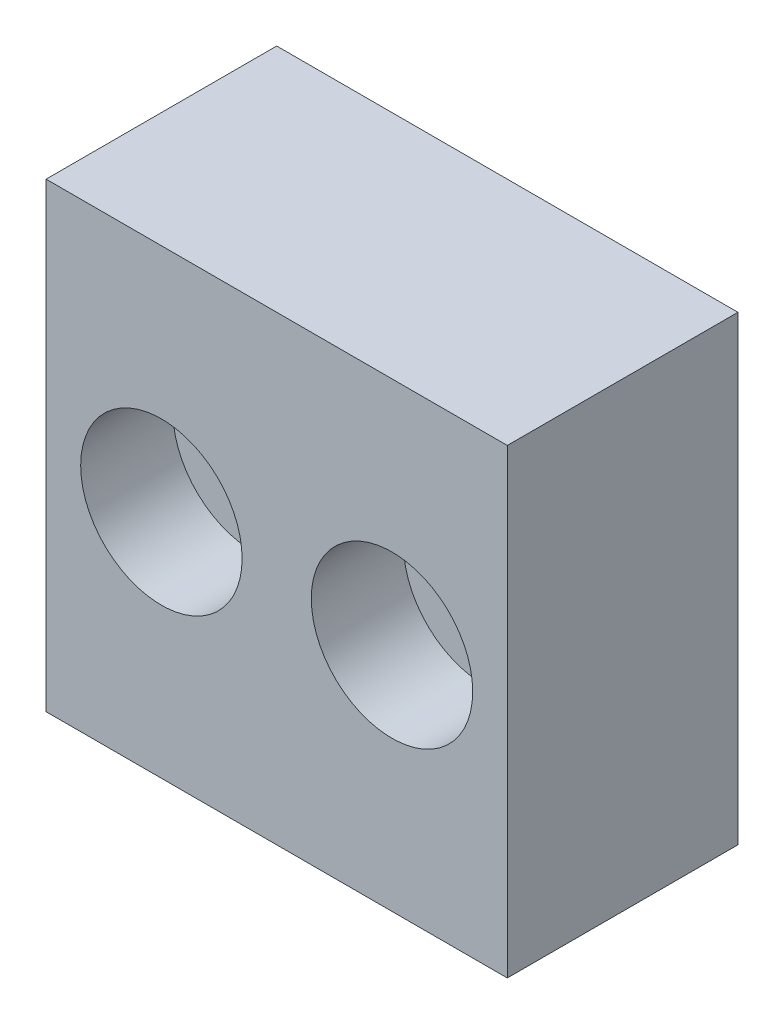
ISO-10303-21;
HEADER;
FILE_DESCRIPTION(('STEP AP214'),'2;1');
FILE_NAME('part.step','',(''),(''),'','','');
FILE_SCHEMA(('AUTOMOTIVE_DESIGN { 1 0 10303 214 1 1 1 1 }'));
ENDSEC;
DATA;
#1=APPLICATION_CONTEXT('core data for automotive mechanical design processes');
#2=APPLICATION_PROTOCOL_DEFINITION('international standard','automotive_design',2000,#1);
#3=PRODUCT_CONTEXT('',#1,'mechanical');
#4=PRODUCT('Part','Part','',(#3));
#5=PRODUCT_RELATED_PRODUCT_CATEGORY('part','',(#4));
#6=PRODUCT_DEFINITION_FORMATION('','',#4);
#7=PRODUCT_DEFINITION_CONTEXT('part definition',#1,'design');
#8=PRODUCT_DEFINITION('design','',#6,#7);
#9=PRODUCT_DEFINITION_SHAPE('','',#8);
#10=(LENGTH_UNIT() NAMED_UNIT(*) SI_UNIT(.MILLI.,.METRE.));
#11=(NAMED_UNIT(*) PLANE_ANGLE_UNIT() SI_UNIT($,.RADIAN.));
#12=(NAMED_UNIT(*) SI_UNIT($,.STERADIAN.) SOLID_ANGLE_UNIT());
#13=UNCERTAINTY_MEASURE_WITH_UNIT(LENGTH_MEASURE(1.E-05),#10,'distance_accuracy_value','');
#14=(GEOMETRIC_REPRESENTATION_CONTEXT(3) GLOBAL_UNCERTAINTY_ASSIGNED_CONTEXT((#13)) GLOBAL_UNIT_ASSIGNED_CONTEXT((#10,
#11,#12)) REPRESENTATION_CONTEXT('',''));
#15=CARTESIAN_POINT('',(0.,0.,0.));
#16=DIRECTION('',(0.,0.,1.));
#17=DIRECTION('',(1.,0.,0.));
#18=AXIS2_PLACEMENT_3D('',#15,#16,#17);
#19=CARTESIAN_POINT('',(10.,10.,10.));
#20=DIRECTION('',(-1.,0.,0.));
#21=DIRECTION('',(0.,-1.,0.));
#22=AXIS2_PLACEMENT_3D('',#19,#20,#21);
#23=PLANE('',#22);
#24=DIRECTION('',(0.,1.,0.));
#25=VECTOR('',#24,1.);
#26=CARTESIAN_POINT('',(10.,10.,0.));
#27=LINE('',#26,#25);
#28=CARTESIAN_POINT('',(10.,-10.,0.));
#29=VERTEX_POINT('',#28);
#30=CARTESIAN_POINT('',(10.,10.,0.));
#31=VERTEX_POINT('',#30);
#32=EDGE_CURVE('E105',#29,#31,#27,.T.);
#33=ORIENTED_EDGE('',*,*,#32,.T.);
#34=DIRECTION('',(0.,0.,-1.));
#35=VECTOR('',#34,1.);
#36=CARTESIAN_POINT('',(10.,10.,10.));
#37=LINE('',#36,#35);
#38=CARTESIAN_POINT('',(10.,10.,10.));
#39=VERTEX_POINT('',#38);
#40=EDGE_CURVE('E11',#39,#31,#37,.T.);
#41=ORIENTED_EDGE('',*,*,#40,.F.);
#42=DIRECTION('',(0.,1.,0.));
#43=VECTOR('',#42,1.);
#44=CARTESIAN_POINT('',(10.,10.,10.));
#45=LINE('',#44,#43);
#46=CARTESIAN_POINT('',(10.,-10.,10.));
#47=VERTEX_POINT('',#46);
#48=EDGE_CURVE('E89',#47,#39,#45,.T.);
#49=ORIENTED_EDGE('',*,*,#48,.F.);
#50=DIRECTION('',(0.,0.,-1.));
#51=VECTOR('',#50,1.);
#52=CARTESIAN_POINT('',(10.,-10.,10.));
#53=LINE('',#52,#51);
#54=EDGE_CURVE('E98',#47,#29,#53,.T.);
#55=ORIENTED_EDGE('',*,*,#54,.T.);
#56=EDGE_LOOP('',(#33,#41,#49,#55));
#57=FACE_BOUND('',#56,.T.);
#58=ADVANCED_FACE('F39',(#57),#23,.F.);
#59=CARTESIAN_POINT('',(-10.,9.99999999999999,10.));
#60=DIRECTION('',(0.,-1.,0.));
#61=DIRECTION('',(1.,0.,0.));
#62=AXIS2_PLACEMENT_3D('',#59,#60,#61);
#63=PLANE('',#62);
#64=DIRECTION('',(-1.,0.,0.));
#65=VECTOR('',#64,1.);
#66=CARTESIAN_POINT('',(-10.,9.99999999999999,0.));
#67=LINE('',#66,#65);
#68=CARTESIAN_POINT('',(-10.,9.99999999999999,0.));
#69=VERTEX_POINT('',#68);
#70=EDGE_CURVE('E94',#31,#69,#67,.T.);
#71=ORIENTED_EDGE('',*,*,#70,.T.);
#72=DIRECTION('',(0.,0.,-1.));
#73=VECTOR('',#72,1.);
#74=CARTESIAN_POINT('',(-10.,9.99999999999999,10.));
#75=LINE('',#74,#73);
#76=CARTESIAN_POINT('',(-10.,9.99999999999999,10.));
#77=VERTEX_POINT('',#76);
#78=EDGE_CURVE('E50',#77,#69,#75,.T.);
#79=ORIENTED_EDGE('',*,*,#78,.F.);
#80=DIRECTION('',(-1.,0.,0.));
#81=VECTOR('',#80,1.);
#82=CARTESIAN_POINT('',(-10.,9.99999999999999,10.));
#83=LINE('',#82,#81);
#84=EDGE_CURVE('E81',#39,#77,#83,.T.);
#85=ORIENTED_EDGE('',*,*,#84,.F.);
#86=ORIENTED_EDGE('',*,*,#40,.T.);
#87=EDGE_LOOP('',(#71,#79,#85,#86));
#88=FACE_BOUND('',#87,.T.);
#89=ADVANCED_FACE('F91',(#88),#63,.F.);
#90=CARTESIAN_POINT('',(-10.,9.99999999999999,10.));
#91=DIRECTION('',(1.,0.,0.));
#92=DIRECTION('',(0.,1.,0.));
#93=AXIS2_PLACEMENT_3D('',#90,#91,#92);
#94=PLANE('',#93);
#95=DIRECTION('',(0.,-1.,0.));
#96=VECTOR('',#95,1.);
#97=CARTESIAN_POINT('',(-10.,9.99999999999999,0.));
#98=LINE('',#97,#96);
#99=CARTESIAN_POINT('',(-10.,-10.,0.));
#100=VERTEX_POINT('',#99);
#101=EDGE_CURVE('E75',#69,#100,#98,.T.);
#102=ORIENTED_EDGE('',*,*,#101,.T.);
#103=DIRECTION('',(0.,0.,-1.));
#104=VECTOR('',#103,1.);
#105=CARTESIAN_POINT('',(-10.,-10.,10.));
#106=LINE('',#105,#104);
#107=CARTESIAN_POINT('',(-10.,-10.,10.));
#108=VERTEX_POINT('',#107);
#109=EDGE_CURVE('E92',#108,#100,#106,.T.);
#110=ORIENTED_EDGE('',*,*,#109,.F.);
#111=DIRECTION('',(0.,-1.,0.));
#112=VECTOR('',#111,1.);
#113=CARTESIAN_POINT('',(-10.,9.99999999999999,10.));
#114=LINE('',#113,#112);
#115=EDGE_CURVE('E86',#77,#108,#114,.T.);
#116=ORIENTED_EDGE('',*,*,#115,.F.);
#117=ORIENTED_EDGE('',*,*,#78,.T.);
#118=EDGE_LOOP('',(#102,#110,#116,#117));
#119=FACE_BOUND('',#118,.T.);
#120=ADVANCED_FACE('F96',(#119),#94,.F.);
#121=CARTESIAN_POINT('',(-10.,-10.,10.));
#122=DIRECTION('',(0.,1.,0.));
#123=DIRECTION('',(0.,0.,1.));
#124=AXIS2_PLACEMENT_3D('',#121,#122,#123);
#125=PLANE('',#124);
#126=DIRECTION('',(1.,0.,0.));
#127=VECTOR('',#126,1.);
#128=CARTESIAN_POINT('',(-10.,-10.,0.));
#129=LINE('',#128,#127);
#130=EDGE_CURVE('E79',#100,#29,#129,.T.);
#131=ORIENTED_EDGE('',*,*,#130,.T.);
#132=ORIENTED_EDGE('',*,*,#54,.F.);
#133=DIRECTION('',(1.,0.,0.));
#134=VECTOR('',#133,1.);
#135=CARTESIAN_POINT('',(-10.,-10.,10.));
#136=LINE('',#135,#134);
#137=EDGE_CURVE('E54',#108,#47,#136,.T.);
#138=ORIENTED_EDGE('',*,*,#137,.F.);
#139=ORIENTED_EDGE('',*,*,#109,.T.);
#140=EDGE_LOOP('',(#131,#132,#138,#139));
#141=FACE_BOUND('',#140,.T.);
#142=ADVANCED_FACE('F109',(#141),#125,.F.);
#143=CARTESIAN_POINT('',(0.,0.,10.));
#144=DIRECTION('',(0.,0.,1.));
#145=DIRECTION('',(1.,0.,0.));
#146=AXIS2_PLACEMENT_3D('',#143,#144,#145);
#147=PLANE('',#146);
#148=CARTESIAN_POINT('',(5.,0.,10.));
#149=DIRECTION('',(0.,0.,1.));
#150=DIRECTION('',(1.,0.,0.));
#151=AXIS2_PLACEMENT_3D('',#148,#149,#150);
#152=CIRCLE('',#151,3.5);
#153=CARTESIAN_POINT('',(8.5,0.,10.));
#154=VERTEX_POINT('',#153);
#155=EDGE_CURVE('E138',#154,#154,#152,.T.);
#156=ORIENTED_EDGE('',*,*,#155,.F.);
#157=EDGE_LOOP('',(#156));
#158=FACE_BOUND('',#157,.T.);
#159=CARTESIAN_POINT('',(-5.,0.,10.));
#160=DIRECTION('',(0.,0.,1.));
#161=DIRECTION('',(1.,0.,0.));
#162=AXIS2_PLACEMENT_3D('',#159,#160,#161);
#163=CIRCLE('',#162,3.5);
#164=CARTESIAN_POINT('',(-1.5,0.,10.));
#165=VERTEX_POINT('',#164);
#166=EDGE_CURVE('E125',#165,#165,#163,.T.);
#167=ORIENTED_EDGE('',*,*,#166,.F.);
#168=EDGE_LOOP('',(#167));
#169=FACE_BOUND('',#168,.T.);
#170=ORIENTED_EDGE('',*,*,#48,.T.);
#171=ORIENTED_EDGE('',*,*,#84,.T.);
#172=ORIENTED_EDGE('',*,*,#115,.T.);
#173=ORIENTED_EDGE('',*,*,#137,.T.);
#174=EDGE_LOOP('',(#170,#171,#172,#173));
#175=FACE_BOUND('',#174,.T.);
#176=ADVANCED_FACE('F88',(#158,#169,#175),#147,.T.);
#177=CARTESIAN_POINT('',(0.,0.,0.));
#178=DIRECTION('',(0.,0.,1.));
#179=DIRECTION('',(1.,0.,0.));
#180=AXIS2_PLACEMENT_3D('',#177,#178,#179);
#181=PLANE('',#180);
#182=CARTESIAN_POINT('',(5.,0.,0.));
#183=DIRECTION('',(0.,0.,1.));
#184=DIRECTION('',(1.,0.,0.));
#185=AXIS2_PLACEMENT_3D('',#182,#183,#184);
#186=CIRCLE('',#185,2.15);
#187=CARTESIAN_POINT('',(7.15,0.,0.));
#188=VERTEX_POINT('',#187);
#189=EDGE_CURVE('E130',#188,#188,#186,.T.);
#190=ORIENTED_EDGE('',*,*,#189,.T.);
#191=EDGE_LOOP('',(#190));
#192=FACE_BOUND('',#191,.T.);
#193=CARTESIAN_POINT('',(-5.,0.,0.));
#194=DIRECTION('',(0.,0.,1.));
#195=DIRECTION('',(1.,0.,0.));
#196=AXIS2_PLACEMENT_3D('',#193,#194,#195);
#197=CIRCLE('',#196,2.15);
#198=CARTESIAN_POINT('',(-2.85,0.,0.));
#199=VERTEX_POINT('',#198);
#200=EDGE_CURVE('E104',#199,#199,#197,.T.);
#201=ORIENTED_EDGE('',*,*,#200,.T.);
#202=EDGE_LOOP('',(#201));
#203=FACE_BOUND('',#202,.T.);
#204=ORIENTED_EDGE('',*,*,#32,.F.);
#205=ORIENTED_EDGE('',*,*,#130,.F.);
#206=ORIENTED_EDGE('',*,*,#101,.F.);
#207=ORIENTED_EDGE('',*,*,#70,.F.);
#208=EDGE_LOOP('',(#204,#205,#206,#207));
#209=FACE_BOUND('',#208,.T.);
#210=ADVANCED_FACE('F114',(#192,#203,#209),#181,.F.);
#211=CARTESIAN_POINT('',(-5.,0.,10.));
#212=DIRECTION('',(0.,0.,1.));
#213=DIRECTION('',(1.,0.,0.));
#214=AXIS2_PLACEMENT_3D('',#211,#212,#213);
#215=CYLINDRICAL_SURFACE('',#214,2.15);
#216=ORIENTED_EDGE('',*,*,#200,.F.);
#217=EDGE_LOOP('',(#216));
#218=FACE_BOUND('',#217,.T.);
#219=CARTESIAN_POINT('',(-5.,0.,6.));
#220=DIRECTION('',(0.,0.,1.));
#221=DIRECTION('',(1.,0.,0.));
#222=AXIS2_PLACEMENT_3D('',#219,#220,#221);
#223=CIRCLE('',#222,2.15);
#224=CARTESIAN_POINT('',(-2.85,0.,6.));
#225=VERTEX_POINT('',#224);
#226=EDGE_CURVE('E119',#225,#225,#223,.T.);
#227=ORIENTED_EDGE('',*,*,#226,.T.);
#228=EDGE_LOOP('',(#227));
#229=FACE_BOUND('',#228,.T.);
#230=ADVANCED_FACE('F159',(#218,#229),#215,.F.);
#231=CARTESIAN_POINT('',(-2.85,0.,6.));
#232=DIRECTION('',(0.,0.,-1.));
#233=DIRECTION('',(-1.,0.,0.));
#234=AXIS2_PLACEMENT_3D('',#231,#232,#233);
#235=PLANE('',#234);
#236=ORIENTED_EDGE('',*,*,#226,.F.);
#237=EDGE_LOOP('',(#236));
#238=FACE_BOUND('',#237,.T.);
#239=CARTESIAN_POINT('',(-5.,0.,6.));
#240=DIRECTION('',(0.,0.,1.));
#241=DIRECTION('',(1.,0.,0.));
#242=AXIS2_PLACEMENT_3D('',#239,#240,#241);
#243=CIRCLE('',#242,3.5);
#244=CARTESIAN_POINT('',(-1.5,0.,6.));
#245=VERTEX_POINT('',#244);
#246=EDGE_CURVE('E123',#245,#245,#243,.T.);
#247=ORIENTED_EDGE('',*,*,#246,.T.);
#248=EDGE_LOOP('',(#247));
#249=FACE_BOUND('',#248,.T.);
#250=ADVANCED_FACE('F147',(#238,#249),#235,.F.);
#251=CARTESIAN_POINT('',(-5.,0.,10.));
#252=DIRECTION('',(0.,0.,1.));
#253=DIRECTION('',(1.,0.,0.));
#254=AXIS2_PLACEMENT_3D('',#251,#252,#253);
#255=CYLINDRICAL_SURFACE('',#254,3.5);
#256=ORIENTED_EDGE('',*,*,#246,.F.);
#257=EDGE_LOOP('',(#256));
#258=FACE_BOUND('',#257,.T.);
#259=ORIENTED_EDGE('',*,*,#166,.T.);
#260=EDGE_LOOP('',(#259));
#261=FACE_BOUND('',#260,.T.);
#262=ADVANCED_FACE('F150',(#258,#261),#255,.F.);
#263=CARTESIAN_POINT('',(5.,0.,10.));
#264=DIRECTION('',(0.,0.,1.));
#265=DIRECTION('',(1.,0.,0.));
#266=AXIS2_PLACEMENT_3D('',#263,#264,#265);
#267=CYLINDRICAL_SURFACE('',#266,2.15);
#268=ORIENTED_EDGE('',*,*,#189,.F.);
#269=EDGE_LOOP('',(#268));
#270=FACE_BOUND('',#269,.T.);
#271=CARTESIAN_POINT('',(5.,0.,6.));
#272=DIRECTION('',(0.,0.,1.));
#273=DIRECTION('',(1.,0.,0.));
#274=AXIS2_PLACEMENT_3D('',#271,#272,#273);
#275=CIRCLE('',#274,2.15);
#276=CARTESIAN_POINT('',(7.15,0.,6.));
#277=VERTEX_POINT('',#276);
#278=EDGE_CURVE('E128',#277,#277,#275,.T.);
#279=ORIENTED_EDGE('',*,*,#278,.T.);
#280=EDGE_LOOP('',(#279));
#281=FACE_BOUND('',#280,.T.);
#282=ADVANCED_FACE('F149',(#270,#281),#267,.F.);
#283=CARTESIAN_POINT('',(7.15,0.,6.));
#284=DIRECTION('',(0.,0.,-1.));
#285=DIRECTION('',(-1.,0.,0.));
#286=AXIS2_PLACEMENT_3D('',#283,#284,#285);
#287=PLANE('',#286);
#288=ORIENTED_EDGE('',*,*,#278,.F.);
#289=EDGE_LOOP('',(#288));
#290=FACE_BOUND('',#289,.T.);
#291=CARTESIAN_POINT('',(5.,0.,6.));
#292=DIRECTION('',(0.,0.,1.));
#293=DIRECTION('',(1.,0.,0.));
#294=AXIS2_PLACEMENT_3D('',#291,#292,#293);
#295=CIRCLE('',#294,3.5);
#296=CARTESIAN_POINT('',(8.5,0.,6.));
#297=VERTEX_POINT('',#296);
#298=EDGE_CURVE('E134',#297,#297,#295,.T.);
#299=ORIENTED_EDGE('',*,*,#298,.T.);
#300=EDGE_LOOP('',(#299));
#301=FACE_BOUND('',#300,.T.);
#302=ADVANCED_FACE('F160',(#290,#301),#287,.F.);
#303=CARTESIAN_POINT('',(5.,0.,10.));
#304=DIRECTION('',(0.,0.,1.));
#305=DIRECTION('',(1.,0.,0.));
#306=AXIS2_PLACEMENT_3D('',#303,#304,#305);
#307=CYLINDRICAL_SURFACE('',#306,3.5);
#308=ORIENTED_EDGE('',*,*,#298,.F.);
#309=EDGE_LOOP('',(#308));
#310=FACE_BOUND('',#309,.T.);
#311=ORIENTED_EDGE('',*,*,#155,.T.);
#312=EDGE_LOOP('',(#311));
#313=FACE_BOUND('',#312,.T.);
#314=ADVANCED_FACE('F136',(#310,#313),#307,.F.);
#315=CLOSED_SHELL('',(#58,#89,#120,#142,#176,#210,#230,#250,#262,#282,#302,#314));
#316=MANIFOLD_SOLID_BREP('B2',#315);
#317=ADVANCED_BREP_SHAPE_REPRESENTATION('',(#18,#316),#14);
#318=SHAPE_DEFINITION_REPRESENTATION(#9,#317);
ENDSEC;
END-ISO-10303-21;
